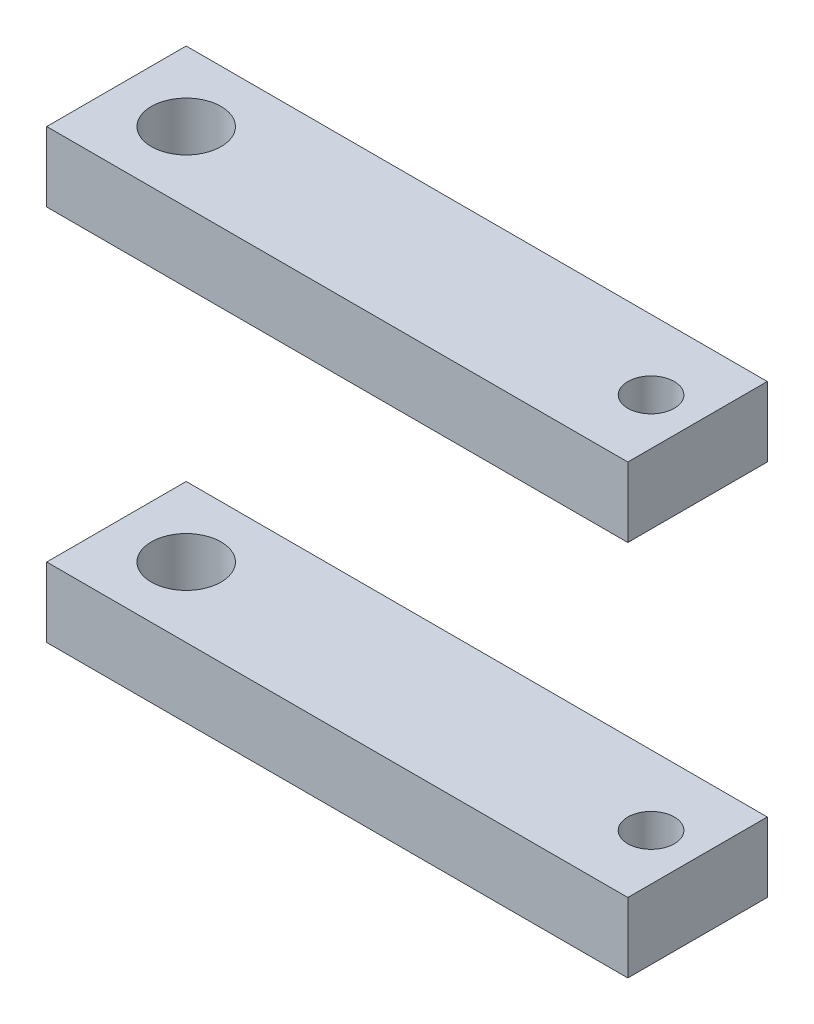
ISO-10303-21;
HEADER;
FILE_DESCRIPTION(('STEP AP214'),'2;1');
FILE_NAME('part.step','',(''),(''),'','','');
FILE_SCHEMA(('AUTOMOTIVE_DESIGN { 1 0 10303 214 1 1 1 1 }'));
ENDSEC;
DATA;
#1=APPLICATION_CONTEXT('core data for automotive mechanical design processes');
#2=APPLICATION_PROTOCOL_DEFINITION('international standard','automotive_design',2000,#1);
#3=PRODUCT_CONTEXT('',#1,'mechanical');
#4=PRODUCT('Part','Part','',(#3));
#5=PRODUCT_RELATED_PRODUCT_CATEGORY('part','',(#4));
#6=PRODUCT_DEFINITION_FORMATION('','',#4);
#7=PRODUCT_DEFINITION_CONTEXT('part definition',#1,'design');
#8=PRODUCT_DEFINITION('design','',#6,#7);
#9=PRODUCT_DEFINITION_SHAPE('','',#8);
#10=(LENGTH_UNIT() NAMED_UNIT(*) SI_UNIT(.MILLI.,.METRE.));
#11=(NAMED_UNIT(*) PLANE_ANGLE_UNIT() SI_UNIT($,.RADIAN.));
#12=(NAMED_UNIT(*) SI_UNIT($,.STERADIAN.) SOLID_ANGLE_UNIT());
#13=UNCERTAINTY_MEASURE_WITH_UNIT(LENGTH_MEASURE(1.E-05),#10,'distance_accuracy_value','');
#14=(GEOMETRIC_REPRESENTATION_CONTEXT(3) GLOBAL_UNCERTAINTY_ASSIGNED_CONTEXT((#13)) GLOBAL_UNIT_ASSIGNED_CONTEXT((#10,
#11,#12)) REPRESENTATION_CONTEXT('',''));
#15=CARTESIAN_POINT('',(0.,0.,0.));
#16=DIRECTION('',(0.,0.,1.));
#17=DIRECTION('',(1.,0.,0.));
#18=AXIS2_PLACEMENT_3D('',#15,#16,#17);
#19=CARTESIAN_POINT('',(-12.5275658201304,-36.639224137931,12.));
#20=DIRECTION('',(-1.,0.,0.));
#21=DIRECTION('',(0.,0.,1.));
#22=AXIS2_PLACEMENT_3D('',#19,#20,#21);
#23=PLANE('',#22);
#24=DIRECTION('',(0.,1.,0.));
#25=VECTOR('',#24,1.);
#26=CARTESIAN_POINT('',(-12.5275658201304,-36.639224137931,0.));
#27=LINE('',#26,#25);
#28=CARTESIAN_POINT('',(-12.5275658201304,-42.639224137931,0.));
#29=VERTEX_POINT('',#28);
#30=CARTESIAN_POINT('',(-12.5275658201304,-36.639224137931,0.));
#31=VERTEX_POINT('',#30);
#32=EDGE_CURVE('E120',#29,#31,#27,.T.);
#33=ORIENTED_EDGE('',*,*,#32,.T.);
#34=DIRECTION('',(0.,0.,-1.));
#35=VECTOR('',#34,1.);
#36=CARTESIAN_POINT('',(-12.5275658201304,-36.639224137931,12.));
#37=LINE('',#36,#35);
#38=CARTESIAN_POINT('',(-12.5275658201304,-36.639224137931,12.));
#39=VERTEX_POINT('',#38);
#40=EDGE_CURVE('E12',#39,#31,#37,.T.);
#41=ORIENTED_EDGE('',*,*,#40,.F.);
#42=DIRECTION('',(0.,1.,0.));
#43=VECTOR('',#42,1.);
#44=CARTESIAN_POINT('',(-12.5275658201304,-36.639224137931,12.));
#45=LINE('',#44,#43);
#46=CARTESIAN_POINT('',(-12.5275658201304,-42.639224137931,12.));
#47=VERTEX_POINT('',#46);
#48=EDGE_CURVE('E103',#47,#39,#45,.T.);
#49=ORIENTED_EDGE('',*,*,#48,.F.);
#50=DIRECTION('',(0.,0.,-1.));
#51=VECTOR('',#50,1.);
#52=CARTESIAN_POINT('',(-12.5275658201304,-42.639224137931,12.));
#53=LINE('',#52,#51);
#54=EDGE_CURVE('E116',#47,#29,#53,.T.);
#55=ORIENTED_EDGE('',*,*,#54,.T.);
#56=EDGE_LOOP('',(#33,#41,#49,#55));
#57=FACE_BOUND('',#56,.T.);
#58=ADVANCED_FACE('F49',(#57),#23,.F.);
#59=CARTESIAN_POINT('',(-12.5275658201304,-36.639224137931,12.));
#60=DIRECTION('',(0.,-1.,0.));
#61=DIRECTION('',(1.,0.,0.));
#62=AXIS2_PLACEMENT_3D('',#59,#60,#61);
#63=PLANE('',#62);
#64=CARTESIAN_POINT('',(-56.5275658201304,-36.639224137931,6.00000000000001));
#65=DIRECTION('',(0.,-1.,0.));
#66=DIRECTION('',(1.,0.,0.));
#67=AXIS2_PLACEMENT_3D('',#64,#65,#66);
#68=CIRCLE('',#67,3.);
#69=CARTESIAN_POINT('',(-53.5275658201304,-36.639224137931,6.00000000000001));
#70=VERTEX_POINT('',#69);
#71=EDGE_CURVE('E124',#70,#70,#68,.T.);
#72=ORIENTED_EDGE('',*,*,#71,.T.);
#73=EDGE_LOOP('',(#72));
#74=FACE_BOUND('',#73,.T.);
#75=CARTESIAN_POINT('',(-16.5275658201304,-36.639224137931,6.));
#76=DIRECTION('',(0.,-1.,0.));
#77=DIRECTION('',(1.,0.,0.));
#78=AXIS2_PLACEMENT_3D('',#75,#76,#77);
#79=CIRCLE('',#78,2.);
#80=CARTESIAN_POINT('',(-14.5275658201304,-36.639224137931,6.));
#81=VERTEX_POINT('',#80);
#82=EDGE_CURVE('E137',#81,#81,#79,.T.);
#83=ORIENTED_EDGE('',*,*,#82,.T.);
#84=EDGE_LOOP('',(#83));
#85=FACE_BOUND('',#84,.T.);
#86=DIRECTION('',(-1.,0.,0.));
#87=VECTOR('',#86,1.);
#88=CARTESIAN_POINT('',(-12.5275658201304,-36.639224137931,0.));
#89=LINE('',#88,#87);
#90=CARTESIAN_POINT('',(-62.5275658201304,-36.639224137931,0.));
#91=VERTEX_POINT('',#90);
#92=EDGE_CURVE('E108',#31,#91,#89,.T.);
#93=ORIENTED_EDGE('',*,*,#92,.T.);
#94=DIRECTION('',(0.,0.,-1.));
#95=VECTOR('',#94,1.);
#96=CARTESIAN_POINT('',(-62.5275658201304,-36.639224137931,12.));
#97=LINE('',#96,#95);
#98=CARTESIAN_POINT('',(-62.5275658201304,-36.639224137931,12.));
#99=VERTEX_POINT('',#98);
#100=EDGE_CURVE('E59',#99,#91,#97,.T.);
#101=ORIENTED_EDGE('',*,*,#100,.F.);
#102=DIRECTION('',(-1.,0.,0.));
#103=VECTOR('',#102,1.);
#104=CARTESIAN_POINT('',(-12.5275658201304,-36.639224137931,12.));
#105=LINE('',#104,#103);
#106=EDGE_CURVE('E98',#39,#99,#105,.T.);
#107=ORIENTED_EDGE('',*,*,#106,.F.);
#108=ORIENTED_EDGE('',*,*,#40,.T.);
#109=EDGE_LOOP('',(#93,#101,#107,#108));
#110=FACE_BOUND('',#109,.T.);
#111=ADVANCED_FACE('F107',(#74,#85,#110),#63,.F.);
#112=CARTESIAN_POINT('',(-62.5275658201304,-36.639224137931,12.));
#113=DIRECTION('',(1.,0.,0.));
#114=DIRECTION('',(0.,0.,-1.));
#115=AXIS2_PLACEMENT_3D('',#112,#113,#114);
#116=PLANE('',#115);
#117=DIRECTION('',(0.,-1.,0.));
#118=VECTOR('',#117,1.);
#119=CARTESIAN_POINT('',(-62.5275658201304,-36.639224137931,0.));
#120=LINE('',#119,#118);
#121=CARTESIAN_POINT('',(-62.5275658201304,-42.639224137931,0.));
#122=VERTEX_POINT('',#121);
#123=EDGE_CURVE('E85',#91,#122,#120,.T.);
#124=ORIENTED_EDGE('',*,*,#123,.T.);
#125=DIRECTION('',(0.,0.,-1.));
#126=VECTOR('',#125,1.);
#127=CARTESIAN_POINT('',(-62.5275658201304,-42.639224137931,12.));
#128=LINE('',#127,#126);
#129=CARTESIAN_POINT('',(-62.5275658201304,-42.639224137931,12.));
#130=VERTEX_POINT('',#129);
#131=EDGE_CURVE('E110',#130,#122,#128,.T.);
#132=ORIENTED_EDGE('',*,*,#131,.F.);
#133=DIRECTION('',(0.,-1.,0.));
#134=VECTOR('',#133,1.);
#135=CARTESIAN_POINT('',(-62.5275658201304,-36.639224137931,12.));
#136=LINE('',#135,#134);
#137=EDGE_CURVE('E101',#99,#130,#136,.T.);
#138=ORIENTED_EDGE('',*,*,#137,.F.);
#139=ORIENTED_EDGE('',*,*,#100,.T.);
#140=EDGE_LOOP('',(#124,#132,#138,#139));
#141=FACE_BOUND('',#140,.T.);
#142=ADVANCED_FACE('F112',(#141),#116,.F.);
#143=CARTESIAN_POINT('',(-12.5275658201304,-42.639224137931,12.));
#144=DIRECTION('',(0.,1.,0.));
#145=DIRECTION('',(0.,0.,1.));
#146=AXIS2_PLACEMENT_3D('',#143,#144,#145);
#147=PLANE('',#146);
#148=CARTESIAN_POINT('',(-56.5275658201304,-42.639224137931,6.00000000000001));
#149=DIRECTION('',(0.,1.,0.));
#150=DIRECTION('',(0.,0.,1.));
#151=AXIS2_PLACEMENT_3D('',#148,#149,#150);
#152=CIRCLE('',#151,3.);
#153=CARTESIAN_POINT('',(-56.5275658201304,-42.639224137931,9.00000000000001));
#154=VERTEX_POINT('',#153);
#155=EDGE_CURVE('E52',#154,#154,#152,.T.);
#156=ORIENTED_EDGE('',*,*,#155,.T.);
#157=EDGE_LOOP('',(#156));
#158=FACE_BOUND('',#157,.T.);
#159=CARTESIAN_POINT('',(-16.5275658201304,-42.639224137931,6.));
#160=DIRECTION('',(0.,1.,0.));
#161=DIRECTION('',(0.,0.,1.));
#162=AXIS2_PLACEMENT_3D('',#159,#160,#161);
#163=CIRCLE('',#162,2.);
#164=CARTESIAN_POINT('',(-16.5275658201304,-42.639224137931,8.));
#165=VERTEX_POINT('',#164);
#166=EDGE_CURVE('E134',#165,#165,#163,.T.);
#167=ORIENTED_EDGE('',*,*,#166,.T.);
#168=EDGE_LOOP('',(#167));
#169=FACE_BOUND('',#168,.T.);
#170=DIRECTION('',(1.,0.,0.));
#171=VECTOR('',#170,1.);
#172=CARTESIAN_POINT('',(-12.5275658201304,-42.639224137931,0.));
#173=LINE('',#172,#171);
#174=EDGE_CURVE('E91',#122,#29,#173,.T.);
#175=ORIENTED_EDGE('',*,*,#174,.T.);
#176=ORIENTED_EDGE('',*,*,#54,.F.);
#177=DIRECTION('',(1.,0.,0.));
#178=VECTOR('',#177,1.);
#179=CARTESIAN_POINT('',(-12.5275658201304,-42.639224137931,12.));
#180=LINE('',#179,#178);
#181=EDGE_CURVE('E68',#130,#47,#180,.T.);
#182=ORIENTED_EDGE('',*,*,#181,.F.);
#183=ORIENTED_EDGE('',*,*,#131,.T.);
#184=EDGE_LOOP('',(#175,#176,#182,#183));
#185=FACE_BOUND('',#184,.T.);
#186=ADVANCED_FACE('F178',(#158,#169,#185),#147,.F.);
#187=CARTESIAN_POINT('',(0.,0.,12.));
#188=DIRECTION('',(0.,0.,-1.));
#189=DIRECTION('',(-1.,0.,0.));
#190=AXIS2_PLACEMENT_3D('',#187,#188,#189);
#191=PLANE('',#190);
#192=ORIENTED_EDGE('',*,*,#48,.T.);
#193=ORIENTED_EDGE('',*,*,#106,.T.);
#194=ORIENTED_EDGE('',*,*,#137,.T.);
#195=ORIENTED_EDGE('',*,*,#181,.T.);
#196=EDGE_LOOP('',(#192,#193,#194,#195));
#197=FACE_BOUND('',#196,.T.);
#198=ADVANCED_FACE('F99',(#197),#191,.F.);
#199=CARTESIAN_POINT('',(0.,0.,0.));
#200=DIRECTION('',(0.,0.,-1.));
#201=DIRECTION('',(-1.,0.,0.));
#202=AXIS2_PLACEMENT_3D('',#199,#200,#201);
#203=PLANE('',#202);
#204=ORIENTED_EDGE('',*,*,#32,.F.);
#205=ORIENTED_EDGE('',*,*,#174,.F.);
#206=ORIENTED_EDGE('',*,*,#123,.F.);
#207=ORIENTED_EDGE('',*,*,#92,.F.);
#208=EDGE_LOOP('',(#204,#205,#206,#207));
#209=FACE_BOUND('',#208,.T.);
#210=ADVANCED_FACE('F162',(#209),#203,.T.);
#211=CARTESIAN_POINT('',(-16.5275658201304,-44.189224137931,6.));
#212=DIRECTION('',(0.,1.,0.));
#213=DIRECTION('',(-1.,0.,0.));
#214=AXIS2_PLACEMENT_3D('',#211,#212,#213);
#215=CYLINDRICAL_SURFACE('',#214,2.);
#216=ORIENTED_EDGE('',*,*,#166,.F.);
#217=EDGE_LOOP('',(#216));
#218=FACE_BOUND('',#217,.T.);
#219=ORIENTED_EDGE('',*,*,#82,.F.);
#220=EDGE_LOOP('',(#219));
#221=FACE_BOUND('',#220,.T.);
#222=ADVANCED_FACE('F156',(#218,#221),#215,.F.);
#223=CARTESIAN_POINT('',(-56.5275658201304,-44.189224137931,6.00000000000001));
#224=DIRECTION('',(0.,1.,0.));
#225=DIRECTION('',(-1.,0.,0.));
#226=AXIS2_PLACEMENT_3D('',#223,#224,#225);
#227=CYLINDRICAL_SURFACE('',#226,3.);
#228=ORIENTED_EDGE('',*,*,#155,.F.);
#229=EDGE_LOOP('',(#228));
#230=FACE_BOUND('',#229,.T.);
#231=ORIENTED_EDGE('',*,*,#71,.F.);
#232=EDGE_LOOP('',(#231));
#233=FACE_BOUND('',#232,.T.);
#234=ADVANCED_FACE('F154',(#230,#233),#227,.F.);
#235=CLOSED_SHELL('',(#58,#111,#142,#186,#198,#210,#222,#234));
#236=MANIFOLD_SOLID_BREP('B2',#235);
#237=CARTESIAN_POINT('',(-12.5275658201304,-4.18922413793102,12.));
#238=DIRECTION('',(-1.,0.,0.));
#239=DIRECTION('',(0.,-1.,0.));
#240=AXIS2_PLACEMENT_3D('',#237,#238,#239);
#241=PLANE('',#240);
#242=DIRECTION('',(0.,1.,0.));
#243=VECTOR('',#242,1.);
#244=CARTESIAN_POINT('',(-12.5275658201304,-4.18922413793102,0.));
#245=LINE('',#244,#243);
#246=CARTESIAN_POINT('',(-12.5275658201304,-10.189224137931,0.));
#247=VERTEX_POINT('',#246);
#248=CARTESIAN_POINT('',(-12.5275658201304,-4.18922413793102,0.));
#249=VERTEX_POINT('',#248);
#250=EDGE_CURVE('E297',#247,#249,#245,.T.);
#251=ORIENTED_EDGE('',*,*,#250,.T.);
#252=DIRECTION('',(0.,0.,-1.));
#253=VECTOR('',#252,1.);
#254=CARTESIAN_POINT('',(-12.5275658201304,-4.18922413793102,12.));
#255=LINE('',#254,#253);
#256=CARTESIAN_POINT('',(-12.5275658201304,-4.18922413793102,12.));
#257=VERTEX_POINT('',#256);
#258=EDGE_CURVE('E47',#257,#249,#255,.T.);
#259=ORIENTED_EDGE('',*,*,#258,.F.);
#260=DIRECTION('',(0.,1.,0.));
#261=VECTOR('',#260,1.);
#262=CARTESIAN_POINT('',(-12.5275658201304,-4.18922413793102,12.));
#263=LINE('',#262,#261);
#264=CARTESIAN_POINT('',(-12.5275658201304,-10.189224137931,12.));
#265=VERTEX_POINT('',#264);
#266=EDGE_CURVE('E284',#265,#257,#263,.T.);
#267=ORIENTED_EDGE('',*,*,#266,.F.);
#268=DIRECTION('',(0.,0.,-1.));
#269=VECTOR('',#268,1.);
#270=CARTESIAN_POINT('',(-12.5275658201304,-10.189224137931,12.));
#271=LINE('',#270,#269);
#272=EDGE_CURVE('E293',#265,#247,#271,.T.);
#273=ORIENTED_EDGE('',*,*,#272,.T.);
#274=EDGE_LOOP('',(#251,#259,#267,#273));
#275=FACE_BOUND('',#274,.T.);
#276=ADVANCED_FACE('F231',(#275),#241,.F.);
#277=CARTESIAN_POINT('',(-12.5275658201304,-4.18922413793102,12.));
#278=DIRECTION('',(0.,-1.,0.));
#279=DIRECTION('',(1.,0.,0.));
#280=AXIS2_PLACEMENT_3D('',#277,#278,#279);
#281=PLANE('',#280);
#282=CARTESIAN_POINT('',(-56.5275658201304,-4.18922413793103,6.00000000000001));
#283=DIRECTION('',(0.,1.,0.));
#284=DIRECTION('',(-1.,0.,0.));
#285=AXIS2_PLACEMENT_3D('',#282,#283,#284);
#286=CIRCLE('',#285,3.);
#287=CARTESIAN_POINT('',(-59.5275658201304,-4.18922413793103,6.00000000000001));
#288=VERTEX_POINT('',#287);
#289=EDGE_CURVE('E306',#288,#288,#286,.T.);
#290=ORIENTED_EDGE('',*,*,#289,.F.);
#291=EDGE_LOOP('',(#290));
#292=FACE_BOUND('',#291,.T.);
#293=CARTESIAN_POINT('',(-16.5275658201304,-4.18922413793102,6.));
#294=DIRECTION('',(0.,1.,0.));
#295=DIRECTION('',(-1.,0.,0.));
#296=AXIS2_PLACEMENT_3D('',#293,#294,#295);
#297=CIRCLE('',#296,2.);
#298=CARTESIAN_POINT('',(-18.5275658201304,-4.18922413793102,6.));
#299=VERTEX_POINT('',#298);
#300=EDGE_CURVE('E311',#299,#299,#297,.T.);
#301=ORIENTED_EDGE('',*,*,#300,.F.);
#302=EDGE_LOOP('',(#301));
#303=FACE_BOUND('',#302,.T.);
#304=DIRECTION('',(-1.,0.,0.));
#305=VECTOR('',#304,1.);
#306=CARTESIAN_POINT('',(-12.5275658201304,-4.18922413793102,0.));
#307=LINE('',#306,#305);
#308=CARTESIAN_POINT('',(-62.5275658201304,-4.18922413793103,0.));
#309=VERTEX_POINT('',#308);
#310=EDGE_CURVE('E288',#249,#309,#307,.T.);
#311=ORIENTED_EDGE('',*,*,#310,.T.);
#312=DIRECTION('',(0.,0.,-1.));
#313=VECTOR('',#312,1.);
#314=CARTESIAN_POINT('',(-62.5275658201304,-4.18922413793103,12.));
#315=LINE('',#314,#313);
#316=CARTESIAN_POINT('',(-62.5275658201304,-4.18922413793103,12.));
#317=VERTEX_POINT('',#316);
#318=EDGE_CURVE('E240',#317,#309,#315,.T.);
#319=ORIENTED_EDGE('',*,*,#318,.F.);
#320=DIRECTION('',(-1.,0.,0.));
#321=VECTOR('',#320,1.);
#322=CARTESIAN_POINT('',(-12.5275658201304,-4.18922413793102,12.));
#323=LINE('',#322,#321);
#324=EDGE_CURVE('E279',#257,#317,#323,.T.);
#325=ORIENTED_EDGE('',*,*,#324,.F.);
#326=ORIENTED_EDGE('',*,*,#258,.T.);
#327=EDGE_LOOP('',(#311,#319,#325,#326));
#328=FACE_BOUND('',#327,.T.);
#329=ADVANCED_FACE('F287',(#292,#303,#328),#281,.F.);
#330=CARTESIAN_POINT('',(-62.5275658201304,-4.18922413793103,12.));
#331=DIRECTION('',(1.,0.,0.));
#332=DIRECTION('',(0.,0.,-1.));
#333=AXIS2_PLACEMENT_3D('',#330,#331,#332);
#334=PLANE('',#333);
#335=DIRECTION('',(0.,-1.,0.));
#336=VECTOR('',#335,1.);
#337=CARTESIAN_POINT('',(-62.5275658201304,-4.18922413793103,0.));
#338=LINE('',#337,#336);
#339=CARTESIAN_POINT('',(-62.5275658201304,-10.189224137931,0.));
#340=VERTEX_POINT('',#339);
#341=EDGE_CURVE('E266',#309,#340,#338,.T.);
#342=ORIENTED_EDGE('',*,*,#341,.T.);
#343=DIRECTION('',(0.,0.,-1.));
#344=VECTOR('',#343,1.);
#345=CARTESIAN_POINT('',(-62.5275658201304,-10.189224137931,12.));
#346=LINE('',#345,#344);
#347=CARTESIAN_POINT('',(-62.5275658201304,-10.189224137931,12.));
#348=VERTEX_POINT('',#347);
#349=EDGE_CURVE('E289',#348,#340,#346,.T.);
#350=ORIENTED_EDGE('',*,*,#349,.F.);
#351=DIRECTION('',(0.,-1.,0.));
#352=VECTOR('',#351,1.);
#353=CARTESIAN_POINT('',(-62.5275658201304,-4.18922413793103,12.));
#354=LINE('',#353,#352);
#355=EDGE_CURVE('E282',#317,#348,#354,.T.);
#356=ORIENTED_EDGE('',*,*,#355,.F.);
#357=ORIENTED_EDGE('',*,*,#318,.T.);
#358=EDGE_LOOP('',(#342,#350,#356,#357));
#359=FACE_BOUND('',#358,.T.);
#360=ADVANCED_FACE('F291',(#359),#334,.F.);
#361=CARTESIAN_POINT('',(-12.5275658201304,-10.189224137931,12.));
#362=DIRECTION('',(0.,1.,0.));
#363=DIRECTION('',(-1.,0.,0.));
#364=AXIS2_PLACEMENT_3D('',#361,#362,#363);
#365=PLANE('',#364);
#366=CARTESIAN_POINT('',(-56.5275658201304,-10.189224137931,6.00000000000001));
#367=DIRECTION('',(0.,1.,0.));
#368=DIRECTION('',(-1.,0.,0.));
#369=AXIS2_PLACEMENT_3D('',#366,#367,#368);
#370=CIRCLE('',#369,3.);
#371=CARTESIAN_POINT('',(-59.5275658201304,-10.189224137931,6.00000000000001));
#372=VERTEX_POINT('',#371);
#373=EDGE_CURVE('E234',#372,#372,#370,.T.);
#374=ORIENTED_EDGE('',*,*,#373,.T.);
#375=EDGE_LOOP('',(#374));
#376=FACE_BOUND('',#375,.T.);
#377=CARTESIAN_POINT('',(-16.5275658201304,-10.189224137931,6.));
#378=DIRECTION('',(0.,1.,0.));
#379=DIRECTION('',(-1.,0.,0.));
#380=AXIS2_PLACEMENT_3D('',#377,#378,#379);
#381=CIRCLE('',#380,2.);
#382=CARTESIAN_POINT('',(-18.5275658201304,-10.189224137931,6.));
#383=VERTEX_POINT('',#382);
#384=EDGE_CURVE('E304',#383,#383,#381,.T.);
#385=ORIENTED_EDGE('',*,*,#384,.T.);
#386=EDGE_LOOP('',(#385));
#387=FACE_BOUND('',#386,.T.);
#388=DIRECTION('',(1.,0.,0.));
#389=VECTOR('',#388,1.);
#390=CARTESIAN_POINT('',(-12.5275658201304,-10.189224137931,0.));
#391=LINE('',#390,#389);
#392=EDGE_CURVE('E272',#340,#247,#391,.T.);
#393=ORIENTED_EDGE('',*,*,#392,.T.);
#394=ORIENTED_EDGE('',*,*,#272,.F.);
#395=DIRECTION('',(1.,0.,0.));
#396=VECTOR('',#395,1.);
#397=CARTESIAN_POINT('',(-12.5275658201304,-10.189224137931,12.));
#398=LINE('',#397,#396);
#399=EDGE_CURVE('E249',#348,#265,#398,.T.);
#400=ORIENTED_EDGE('',*,*,#399,.F.);
#401=ORIENTED_EDGE('',*,*,#349,.T.);
#402=EDGE_LOOP('',(#393,#394,#400,#401));
#403=FACE_BOUND('',#402,.T.);
#404=ADVANCED_FACE('F328',(#376,#387,#403),#365,.F.);
#405=CARTESIAN_POINT('',(0.,0.,12.));
#406=DIRECTION('',(0.,0.,-1.));
#407=DIRECTION('',(-1.,0.,0.));
#408=AXIS2_PLACEMENT_3D('',#405,#406,#407);
#409=PLANE('',#408);
#410=ORIENTED_EDGE('',*,*,#266,.T.);
#411=ORIENTED_EDGE('',*,*,#324,.T.);
#412=ORIENTED_EDGE('',*,*,#355,.T.);
#413=ORIENTED_EDGE('',*,*,#399,.T.);
#414=EDGE_LOOP('',(#410,#411,#412,#413));
#415=FACE_BOUND('',#414,.T.);
#416=ADVANCED_FACE('F280',(#415),#409,.F.);
#417=CARTESIAN_POINT('',(0.,0.,0.));
#418=DIRECTION('',(0.,0.,-1.));
#419=DIRECTION('',(-1.,0.,0.));
#420=AXIS2_PLACEMENT_3D('',#417,#418,#419);
#421=PLANE('',#420);
#422=ORIENTED_EDGE('',*,*,#250,.F.);
#423=ORIENTED_EDGE('',*,*,#392,.F.);
#424=ORIENTED_EDGE('',*,*,#341,.F.);
#425=ORIENTED_EDGE('',*,*,#310,.F.);
#426=EDGE_LOOP('',(#422,#423,#424,#425));
#427=FACE_BOUND('',#426,.T.);
#428=ADVANCED_FACE('F335',(#427),#421,.T.);
#429=CARTESIAN_POINT('',(-16.5275658201304,-44.189224137931,6.));
#430=DIRECTION('',(0.,1.,0.));
#431=DIRECTION('',(-1.,0.,0.));
#432=AXIS2_PLACEMENT_3D('',#429,#430,#431);
#433=CYLINDRICAL_SURFACE('',#432,2.);
#434=ORIENTED_EDGE('',*,*,#300,.T.);
#435=EDGE_LOOP('',(#434));
#436=FACE_BOUND('',#435,.T.);
#437=ORIENTED_EDGE('',*,*,#384,.F.);
#438=EDGE_LOOP('',(#437));
#439=FACE_BOUND('',#438,.T.);
#440=ADVANCED_FACE('F319',(#436,#439),#433,.F.);
#441=CARTESIAN_POINT('',(-56.5275658201304,-44.189224137931,6.00000000000001));
#442=DIRECTION('',(0.,1.,0.));
#443=DIRECTION('',(-1.,0.,0.));
#444=AXIS2_PLACEMENT_3D('',#441,#442,#443);
#445=CYLINDRICAL_SURFACE('',#444,3.);
#446=ORIENTED_EDGE('',*,*,#289,.T.);
#447=EDGE_LOOP('',(#446));
#448=FACE_BOUND('',#447,.T.);
#449=ORIENTED_EDGE('',*,*,#373,.F.);
#450=EDGE_LOOP('',(#449));
#451=FACE_BOUND('',#450,.T.);
#452=ADVANCED_FACE('F343',(#448,#451),#445,.F.);
#453=CLOSED_SHELL('',(#276,#329,#360,#404,#416,#428,#440,#452));
#454=MANIFOLD_SOLID_BREP('B6',#453);
#455=ADVANCED_BREP_SHAPE_REPRESENTATION('',(#18,#236,#454),#14);
#456=SHAPE_DEFINITION_REPRESENTATION(#9,#455);
ENDSEC;
END-ISO-10303-21;
